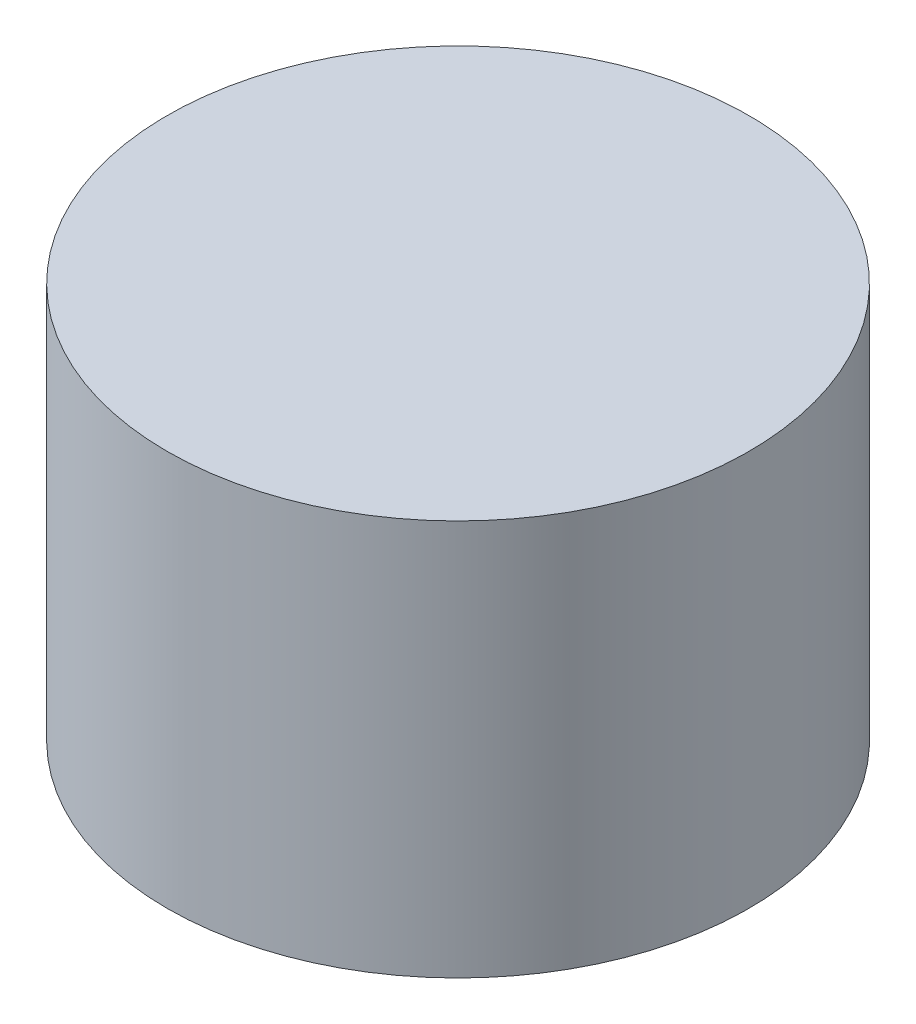
ISO-10303-21;
HEADER;
FILE_DESCRIPTION(('STEP AP214'),'2;1');
FILE_NAME('part.step','',(''),(''),'','','');
FILE_SCHEMA(('AUTOMOTIVE_DESIGN { 1 0 10303 214 1 1 1 1 }'));
ENDSEC;
DATA;
#1=APPLICATION_CONTEXT('core data for automotive mechanical design processes');
#2=APPLICATION_PROTOCOL_DEFINITION('international standard','automotive_design',2000,#1);
#3=PRODUCT_CONTEXT('',#1,'mechanical');
#4=PRODUCT('Part','Part','',(#3));
#5=PRODUCT_RELATED_PRODUCT_CATEGORY('part','',(#4));
#6=PRODUCT_DEFINITION_FORMATION('','',#4);
#7=PRODUCT_DEFINITION_CONTEXT('part definition',#1,'design');
#8=PRODUCT_DEFINITION('design','',#6,#7);
#9=PRODUCT_DEFINITION_SHAPE('','',#8);
#10=(LENGTH_UNIT() NAMED_UNIT(*) SI_UNIT(.MILLI.,.METRE.));
#11=(NAMED_UNIT(*) PLANE_ANGLE_UNIT() SI_UNIT($,.RADIAN.));
#12=(NAMED_UNIT(*) SI_UNIT($,.STERADIAN.) SOLID_ANGLE_UNIT());
#13=UNCERTAINTY_MEASURE_WITH_UNIT(LENGTH_MEASURE(1.E-05),#10,'distance_accuracy_value','');
#14=(GEOMETRIC_REPRESENTATION_CONTEXT(3) GLOBAL_UNCERTAINTY_ASSIGNED_CONTEXT((#13)) GLOBAL_UNIT_ASSIGNED_CONTEXT((#10,
#11,#12)) REPRESENTATION_CONTEXT('',''));
#15=CARTESIAN_POINT('',(0.,0.,0.));
#16=DIRECTION('',(0.,0.,1.));
#17=DIRECTION('',(1.,0.,0.));
#18=AXIS2_PLACEMENT_3D('',#15,#16,#17);
#19=CARTESIAN_POINT('',(0.,10.,0.));
#20=DIRECTION('',(0.,-1.,0.));
#21=DIRECTION('',(0.,0.,-1.));
#22=AXIS2_PLACEMENT_3D('',#19,#20,#21);
#23=CYLINDRICAL_SURFACE('',#22,7.35);
#24=CARTESIAN_POINT('',(0.,10.,0.));
#25=DIRECTION('',(0.,1.,0.));
#26=DIRECTION('',(0.,0.,1.));
#27=AXIS2_PLACEMENT_3D('',#24,#25,#26);
#28=CIRCLE('',#27,7.35);
#29=CARTESIAN_POINT('',(0.,10.,7.35));
#30=VERTEX_POINT('',#29);
#31=EDGE_CURVE('E10',#30,#30,#28,.T.);
#32=ORIENTED_EDGE('',*,*,#31,.F.);
#33=EDGE_LOOP('',(#32));
#34=FACE_BOUND('',#33,.T.);
#35=CARTESIAN_POINT('',(0.,0.,0.));
#36=DIRECTION('',(0.,1.,0.));
#37=DIRECTION('',(0.,0.,1.));
#38=AXIS2_PLACEMENT_3D('',#35,#36,#37);
#39=CIRCLE('',#38,7.35);
#40=CARTESIAN_POINT('',(0.,0.,7.35));
#41=VERTEX_POINT('',#40);
#42=EDGE_CURVE('E39',#41,#41,#39,.T.);
#43=ORIENTED_EDGE('',*,*,#42,.T.);
#44=EDGE_LOOP('',(#43));
#45=FACE_BOUND('',#44,.T.);
#46=ADVANCED_FACE('F36',(#34,#45),#23,.T.);
#47=CARTESIAN_POINT('',(0.,10.,0.));
#48=DIRECTION('',(0.,1.,0.));
#49=DIRECTION('',(0.,0.,1.));
#50=AXIS2_PLACEMENT_3D('',#47,#48,#49);
#51=PLANE('',#50);
#52=ORIENTED_EDGE('',*,*,#31,.T.);
#53=EDGE_LOOP('',(#52));
#54=FACE_BOUND('',#53,.T.);
#55=ADVANCED_FACE('F51',(#54),#51,.T.);
#56=CARTESIAN_POINT('',(0.,0.,0.));
#57=DIRECTION('',(0.,1.,0.));
#58=DIRECTION('',(0.,0.,1.));
#59=AXIS2_PLACEMENT_3D('',#56,#57,#58);
#60=PLANE('',#59);
#61=ORIENTED_EDGE('',*,*,#42,.F.);
#62=EDGE_LOOP('',(#61));
#63=FACE_BOUND('',#62,.T.);
#64=ADVANCED_FACE('F49',(#63),#60,.F.);
#65=CLOSED_SHELL('',(#46,#55,#64));
#66=MANIFOLD_SOLID_BREP('B2',#65);
#67=ADVANCED_BREP_SHAPE_REPRESENTATION('',(#18,#66),#14);
#68=SHAPE_DEFINITION_REPRESENTATION(#9,#67);
ENDSEC;
END-ISO-10303-21;
